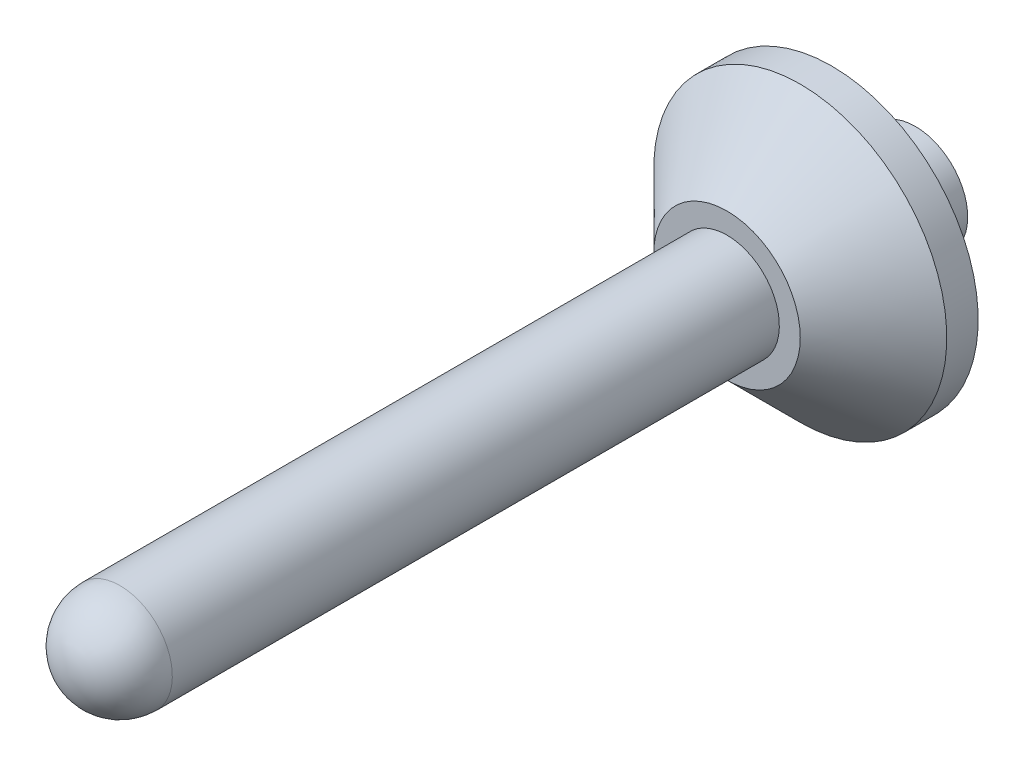
ISO-10303-21;
HEADER;
FILE_DESCRIPTION(('STEP AP214'),'2;1');
FILE_NAME('part.step','',(''),(''),'','','');
FILE_SCHEMA(('AUTOMOTIVE_DESIGN { 1 0 10303 214 1 1 1 1 }'));
ENDSEC;
DATA;
#1=APPLICATION_CONTEXT('core data for automotive mechanical design processes');
#2=APPLICATION_PROTOCOL_DEFINITION('international standard','automotive_design',2000,#1);
#3=PRODUCT_CONTEXT('',#1,'mechanical');
#4=PRODUCT('Part','Part','',(#3));
#5=PRODUCT_RELATED_PRODUCT_CATEGORY('part','',(#4));
#6=PRODUCT_DEFINITION_FORMATION('','',#4);
#7=PRODUCT_DEFINITION_CONTEXT('part definition',#1,'design');
#8=PRODUCT_DEFINITION('design','',#6,#7);
#9=PRODUCT_DEFINITION_SHAPE('','',#8);
#10=(LENGTH_UNIT() NAMED_UNIT(*) SI_UNIT(.MILLI.,.METRE.));
#11=(NAMED_UNIT(*) PLANE_ANGLE_UNIT() SI_UNIT($,.RADIAN.));
#12=(NAMED_UNIT(*) SI_UNIT($,.STERADIAN.) SOLID_ANGLE_UNIT());
#13=UNCERTAINTY_MEASURE_WITH_UNIT(LENGTH_MEASURE(1.E-05),#10,'distance_accuracy_value','');
#14=(GEOMETRIC_REPRESENTATION_CONTEXT(3) GLOBAL_UNCERTAINTY_ASSIGNED_CONTEXT((#13)) GLOBAL_UNIT_ASSIGNED_CONTEXT((#10,
#11,#12)) REPRESENTATION_CONTEXT('',''));
#15=CARTESIAN_POINT('',(0.,0.,0.));
#16=DIRECTION('',(0.,0.,1.));
#17=DIRECTION('',(1.,0.,0.));
#18=AXIS2_PLACEMENT_3D('',#15,#16,#17);
#19=CARTESIAN_POINT('',(0.,0.,11.));
#20=DIRECTION('',(0.,0.,-1.));
#21=DIRECTION('',(0.,1.,0.));
#22=AXIS2_PLACEMENT_3D('',#19,#20,#21);
#23=CONICAL_SURFACE('',#22,14.,0.785398163397443);
#24=CARTESIAN_POINT('',(0.,0.,11.));
#25=DIRECTION('',(0.,0.,-1.));
#26=DIRECTION('',(0.,1.,0.));
#27=AXIS2_PLACEMENT_3D('',#24,#25,#26);
#28=CIRCLE('',#27,14.);
#29=CARTESIAN_POINT('',(0.,14.,11.));
#30=VERTEX_POINT('',#29);
#31=EDGE_CURVE('E51',#30,#30,#28,.T.);
#32=ORIENTED_EDGE('',*,*,#31,.F.);
#33=EDGE_LOOP('',(#32));
#34=FACE_BOUND('',#33,.T.);
#35=CARTESIAN_POINT('',(0.,0.,18.0000000000001));
#36=DIRECTION('',(0.,0.,1.));
#37=DIRECTION('',(1.,0.,0.));
#38=AXIS2_PLACEMENT_3D('',#35,#36,#37);
#39=CIRCLE('',#38,6.99999999999998);
#40=CARTESIAN_POINT('',(6.99999999999998,0.,18.0000000000001));
#41=VERTEX_POINT('',#40);
#42=EDGE_CURVE('E41',#41,#41,#39,.F.);
#43=ORIENTED_EDGE('',*,*,#42,.T.);
#44=EDGE_LOOP('',(#43));
#45=FACE_BOUND('',#44,.T.);
#46=ADVANCED_FACE('F37',(#34,#45),#23,.T.);
#47=CARTESIAN_POINT('',(0.,14.,8.));
#48=DIRECTION('',(0.,0.,-1.));
#49=DIRECTION('',(0.,1.,0.));
#50=AXIS2_PLACEMENT_3D('',#47,#48,#49);
#51=PLANE('',#50);
#52=CARTESIAN_POINT('',(0.,0.,8.));
#53=DIRECTION('',(0.,0.,-1.));
#54=DIRECTION('',(0.,1.,0.));
#55=AXIS2_PLACEMENT_3D('',#52,#53,#54);
#56=CIRCLE('',#55,12.);
#57=CARTESIAN_POINT('',(0.,12.,8.));
#58=VERTEX_POINT('',#57);
#59=EDGE_CURVE('E62',#58,#58,#56,.T.);
#60=ORIENTED_EDGE('',*,*,#59,.F.);
#61=EDGE_LOOP('',(#60));
#62=FACE_BOUND('',#61,.T.);
#63=CARTESIAN_POINT('',(0.,0.,8.));
#64=DIRECTION('',(0.,0.,-1.));
#65=DIRECTION('',(0.,1.,0.));
#66=AXIS2_PLACEMENT_3D('',#63,#64,#65);
#67=CIRCLE('',#66,14.);
#68=CARTESIAN_POINT('',(0.,14.,8.));
#69=VERTEX_POINT('',#68);
#70=EDGE_CURVE('E46',#69,#69,#67,.T.);
#71=ORIENTED_EDGE('',*,*,#70,.T.);
#72=EDGE_LOOP('',(#71));
#73=FACE_BOUND('',#72,.T.);
#74=ADVANCED_FACE('F98',(#62,#73),#51,.T.);
#75=CARTESIAN_POINT('',(0.,0.,0.));
#76=DIRECTION('',(0.,0.,-1.));
#77=DIRECTION('',(0.,1.,0.));
#78=AXIS2_PLACEMENT_3D('',#75,#76,#77);
#79=CYLINDRICAL_SURFACE('',#78,14.);
#80=ORIENTED_EDGE('',*,*,#31,.T.);
#81=EDGE_LOOP('',(#80));
#82=FACE_BOUND('',#81,.T.);
#83=ORIENTED_EDGE('',*,*,#70,.F.);
#84=EDGE_LOOP('',(#83));
#85=FACE_BOUND('',#84,.T.);
#86=ADVANCED_FACE('F104',(#82,#85),#79,.T.);
#87=CARTESIAN_POINT('',(0.,0.,11.));
#88=DIRECTION('',(0.,0.,-1.));
#89=DIRECTION('',(0.,1.,0.));
#90=AXIS2_PLACEMENT_3D('',#87,#88,#89);
#91=CYLINDRICAL_SURFACE('',#90,12.);
#92=CARTESIAN_POINT('',(0.,0.,11.));
#93=DIRECTION('',(0.,0.,-1.));
#94=DIRECTION('',(0.,1.,0.));
#95=AXIS2_PLACEMENT_3D('',#92,#93,#94);
#96=CIRCLE('',#95,12.);
#97=CARTESIAN_POINT('',(0.,12.,11.));
#98=VERTEX_POINT('',#97);
#99=EDGE_CURVE('E61',#98,#98,#96,.T.);
#100=ORIENTED_EDGE('',*,*,#99,.F.);
#101=EDGE_LOOP('',(#100));
#102=FACE_BOUND('',#101,.T.);
#103=ORIENTED_EDGE('',*,*,#59,.T.);
#104=EDGE_LOOP('',(#103));
#105=FACE_BOUND('',#104,.T.);
#106=ADVANCED_FACE('F111',(#102,#105),#91,.F.);
#107=CARTESIAN_POINT('',(0.,0.,11.));
#108=DIRECTION('',(0.,0.,-1.));
#109=DIRECTION('',(0.,1.,0.));
#110=AXIS2_PLACEMENT_3D('',#107,#108,#109);
#111=PLANE('',#110);
#112=CARTESIAN_POINT('',(0.,0.,11.));
#113=DIRECTION('',(0.,0.,-1.));
#114=DIRECTION('',(0.,1.,0.));
#115=AXIS2_PLACEMENT_3D('',#112,#113,#114);
#116=CIRCLE('',#115,5.);
#117=CARTESIAN_POINT('',(0.,5.,11.));
#118=VERTEX_POINT('',#117);
#119=EDGE_CURVE('E66',#118,#118,#116,.T.);
#120=ORIENTED_EDGE('',*,*,#119,.F.);
#121=EDGE_LOOP('',(#120));
#122=FACE_BOUND('',#121,.T.);
#123=ORIENTED_EDGE('',*,*,#99,.T.);
#124=EDGE_LOOP('',(#123));
#125=FACE_BOUND('',#124,.T.);
#126=ADVANCED_FACE('F116',(#122,#125),#111,.T.);
#127=CARTESIAN_POINT('',(0.,5.,0.));
#128=DIRECTION('',(0.,0.,-1.));
#129=DIRECTION('',(0.,1.,0.));
#130=AXIS2_PLACEMENT_3D('',#127,#128,#129);
#131=PLANE('',#130);
#132=CARTESIAN_POINT('',(0.,0.,0.));
#133=DIRECTION('',(0.,0.,-1.));
#134=DIRECTION('',(0.,1.,0.));
#135=AXIS2_PLACEMENT_3D('',#132,#133,#134);
#136=CIRCLE('',#135,5.);
#137=CARTESIAN_POINT('',(0.,5.,0.));
#138=VERTEX_POINT('',#137);
#139=EDGE_CURVE('E10',#138,#138,#136,.T.);
#140=ORIENTED_EDGE('',*,*,#139,.T.);
#141=EDGE_LOOP('',(#140));
#142=FACE_BOUND('',#141,.T.);
#143=ADVANCED_FACE('F39',(#142),#131,.T.);
#144=CARTESIAN_POINT('',(0.,0.,0.));
#145=DIRECTION('',(0.,0.,-1.));
#146=DIRECTION('',(0.,1.,0.));
#147=AXIS2_PLACEMENT_3D('',#144,#145,#146);
#148=CYLINDRICAL_SURFACE('',#147,5.);
#149=ORIENTED_EDGE('',*,*,#139,.F.);
#150=EDGE_LOOP('',(#149));
#151=FACE_BOUND('',#150,.T.);
#152=ORIENTED_EDGE('',*,*,#119,.T.);
#153=EDGE_LOOP('',(#152));
#154=FACE_BOUND('',#153,.T.);
#155=ADVANCED_FACE('F86',(#151,#154),#148,.T.);
#156=CARTESIAN_POINT('',(5.,0.,18.0000000000001));
#157=DIRECTION('',(0.,0.,1.));
#158=DIRECTION('',(1.,0.,0.));
#159=AXIS2_PLACEMENT_3D('',#156,#157,#158);
#160=PLANE('',#159);
#161=ORIENTED_EDGE('',*,*,#42,.F.);
#162=EDGE_LOOP('',(#161));
#163=FACE_BOUND('',#162,.T.);
#164=CARTESIAN_POINT('',(0.,0.,18.0000000000001));
#165=DIRECTION('',(0.,0.,-1.));
#166=DIRECTION('',(-1.,0.,0.));
#167=AXIS2_PLACEMENT_3D('',#164,#165,#166);
#168=CIRCLE('',#167,5.);
#169=CARTESIAN_POINT('',(-5.,0.,18.0000000000001));
#170=VERTEX_POINT('',#169);
#171=EDGE_CURVE('E73',#170,#170,#168,.T.);
#172=ORIENTED_EDGE('',*,*,#171,.T.);
#173=EDGE_LOOP('',(#172));
#174=FACE_BOUND('',#173,.T.);
#175=ADVANCED_FACE('F83',(#163,#174),#160,.T.);
#176=CARTESIAN_POINT('',(0.,0.,76.));
#177=DIRECTION('',(0.,0.,-1.));
#178=DIRECTION('',(0.,1.,0.));
#179=AXIS2_PLACEMENT_3D('',#176,#177,#178);
#180=SPHERICAL_SURFACE('',#179,5.);
#181=CARTESIAN_POINT('',(0.,0.,76.));
#182=DIRECTION('',(0.,0.,-1.));
#183=DIRECTION('',(0.,1.,0.));
#184=AXIS2_PLACEMENT_3D('',#181,#182,#183);
#185=CIRCLE('',#184,5.);
#186=CARTESIAN_POINT('',(0.,4.99999999999998,76.));
#187=VERTEX_POINT('',#186);
#188=EDGE_CURVE('E57',#187,#187,#185,.T.);
#189=ORIENTED_EDGE('',*,*,#188,.F.);
#190=EDGE_LOOP('',(#189));
#191=FACE_BOUND('',#190,.T.);
#192=ADVANCED_FACE('F85',(#191),#180,.T.);
#193=CARTESIAN_POINT('',(0.,0.,0.));
#194=DIRECTION('',(0.,0.,-1.));
#195=DIRECTION('',(0.,1.,0.));
#196=AXIS2_PLACEMENT_3D('',#193,#194,#195);
#197=CYLINDRICAL_SURFACE('',#196,5.);
#198=ORIENTED_EDGE('',*,*,#188,.T.);
#199=EDGE_LOOP('',(#198));
#200=FACE_BOUND('',#199,.T.);
#201=ORIENTED_EDGE('',*,*,#171,.F.);
#202=EDGE_LOOP('',(#201));
#203=FACE_BOUND('',#202,.T.);
#204=ADVANCED_FACE('F92',(#200,#203),#197,.T.);
#205=CLOSED_SHELL('',(#46,#74,#86,#106,#126,#143,#155,#175,#192,#204));
#206=MANIFOLD_SOLID_BREP('B2',#205);
#207=ADVANCED_BREP_SHAPE_REPRESENTATION('',(#18,#206),#14);
#208=SHAPE_DEFINITION_REPRESENTATION(#9,#207);
ENDSEC;
END-ISO-10303-21;
